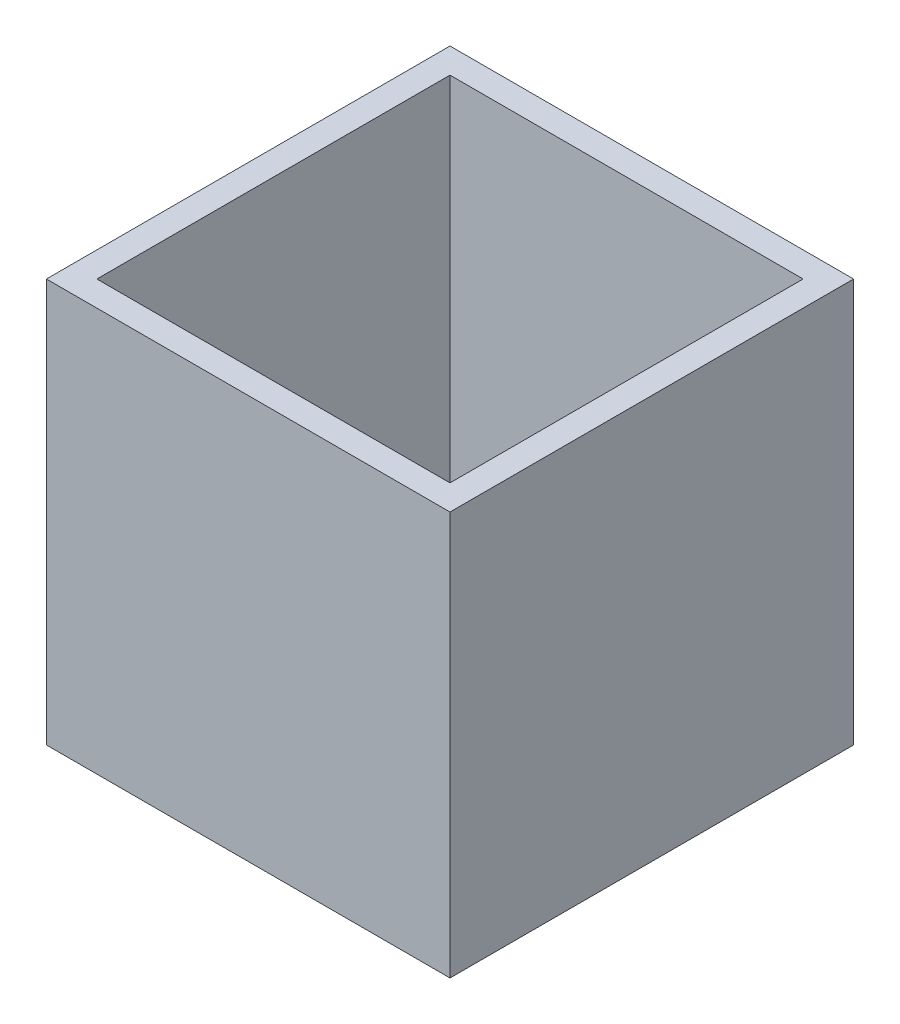
ISO-10303-21;
HEADER;
FILE_DESCRIPTION(('STEP AP214'),'2;1');
FILE_NAME('part.step','',(''),(''),'','','');
FILE_SCHEMA(('AUTOMOTIVE_DESIGN { 1 0 10303 214 1 1 1 1 }'));
ENDSEC;
DATA;
#1=APPLICATION_CONTEXT('core data for automotive mechanical design processes');
#2=APPLICATION_PROTOCOL_DEFINITION('international standard','automotive_design',2000,#1);
#3=PRODUCT_CONTEXT('',#1,'mechanical');
#4=PRODUCT('Part','Part','',(#3));
#5=PRODUCT_RELATED_PRODUCT_CATEGORY('part','',(#4));
#6=PRODUCT_DEFINITION_FORMATION('','',#4);
#7=PRODUCT_DEFINITION_CONTEXT('part definition',#1,'design');
#8=PRODUCT_DEFINITION('design','',#6,#7);
#9=PRODUCT_DEFINITION_SHAPE('','',#8);
#10=(LENGTH_UNIT() NAMED_UNIT(*) SI_UNIT(.MILLI.,.METRE.));
#11=(NAMED_UNIT(*) PLANE_ANGLE_UNIT() SI_UNIT($,.RADIAN.));
#12=(NAMED_UNIT(*) SI_UNIT($,.STERADIAN.) SOLID_ANGLE_UNIT());
#13=UNCERTAINTY_MEASURE_WITH_UNIT(LENGTH_MEASURE(1.E-05),#10,'distance_accuracy_value','');
#14=(GEOMETRIC_REPRESENTATION_CONTEXT(3) GLOBAL_UNCERTAINTY_ASSIGNED_CONTEXT((#13)) GLOBAL_UNIT_ASSIGNED_CONTEXT((#10,
#11,#12)) REPRESENTATION_CONTEXT('',''));
#15=CARTESIAN_POINT('',(0.,0.,0.));
#16=DIRECTION('',(0.,0.,1.));
#17=DIRECTION('',(1.,0.,0.));
#18=AXIS2_PLACEMENT_3D('',#15,#16,#17);
#19=CARTESIAN_POINT('',(0.,25.4,0.));
#20=DIRECTION('',(0.,-1.,0.));
#21=DIRECTION('',(0.,0.,-1.));
#22=AXIS2_PLACEMENT_3D('',#19,#20,#21);
#23=PLANE('',#22);
#24=DIRECTION('',(0.,0.,-1.));
#25=VECTOR('',#24,1.);
#26=CARTESIAN_POINT('',(12.7,25.4,12.7));
#27=LINE('',#26,#25);
#28=CARTESIAN_POINT('',(12.7,25.4,12.7));
#29=VERTEX_POINT('',#28);
#30=CARTESIAN_POINT('',(12.7,25.4,-12.7));
#31=VERTEX_POINT('',#30);
#32=EDGE_CURVE('E134',#29,#31,#27,.T.);
#33=ORIENTED_EDGE('',*,*,#32,.T.);
#34=DIRECTION('',(-1.,0.,0.));
#35=VECTOR('',#34,1.);
#36=CARTESIAN_POINT('',(-12.7,25.4,-12.7));
#37=LINE('',#36,#35);
#38=CARTESIAN_POINT('',(-12.7,25.4,-12.7));
#39=VERTEX_POINT('',#38);
#40=EDGE_CURVE('E137',#31,#39,#37,.T.);
#41=ORIENTED_EDGE('',*,*,#40,.T.);
#42=DIRECTION('',(0.,0.,1.));
#43=VECTOR('',#42,1.);
#44=CARTESIAN_POINT('',(-12.7,25.4,12.7));
#45=LINE('',#44,#43);
#46=CARTESIAN_POINT('',(-12.7,25.4,12.7));
#47=VERTEX_POINT('',#46);
#48=EDGE_CURVE('E140',#39,#47,#45,.T.);
#49=ORIENTED_EDGE('',*,*,#48,.T.);
#50=DIRECTION('',(1.,0.,0.));
#51=VECTOR('',#50,1.);
#52=CARTESIAN_POINT('',(-12.7,25.4,12.7));
#53=LINE('',#52,#51);
#54=EDGE_CURVE('E142',#47,#29,#53,.T.);
#55=ORIENTED_EDGE('',*,*,#54,.T.);
#56=EDGE_LOOP('',(#33,#41,#49,#55));
#57=FACE_BOUND('',#56,.T.);
#58=DIRECTION('',(0.,0.,1.));
#59=VECTOR('',#58,1.);
#60=CARTESIAN_POINT('',(-11.1125,25.4,11.1125));
#61=LINE('',#60,#59);
#62=CARTESIAN_POINT('',(-11.1125,25.4,-11.1125));
#63=VERTEX_POINT('',#62);
#64=CARTESIAN_POINT('',(-11.1125,25.4,11.1125));
#65=VERTEX_POINT('',#64);
#66=EDGE_CURVE('E98',#63,#65,#61,.T.);
#67=ORIENTED_EDGE('',*,*,#66,.F.);
#68=DIRECTION('',(-1.,0.,0.));
#69=VECTOR('',#68,1.);
#70=CARTESIAN_POINT('',(-11.1125,25.4,-11.1125));
#71=LINE('',#70,#69);
#72=CARTESIAN_POINT('',(11.1125,25.4,-11.1125));
#73=VERTEX_POINT('',#72);
#74=EDGE_CURVE('E120',#73,#63,#71,.T.);
#75=ORIENTED_EDGE('',*,*,#74,.F.);
#76=DIRECTION('',(0.,0.,-1.));
#77=VECTOR('',#76,1.);
#78=CARTESIAN_POINT('',(11.1125,25.4,11.1125));
#79=LINE('',#78,#77);
#80=CARTESIAN_POINT('',(11.1125,25.4,11.1125));
#81=VERTEX_POINT('',#80);
#82=EDGE_CURVE('E118',#81,#73,#79,.T.);
#83=ORIENTED_EDGE('',*,*,#82,.F.);
#84=DIRECTION('',(1.,0.,0.));
#85=VECTOR('',#84,1.);
#86=CARTESIAN_POINT('',(-11.1125,25.4,11.1125));
#87=LINE('',#86,#85);
#88=EDGE_CURVE('E106',#65,#81,#87,.T.);
#89=ORIENTED_EDGE('',*,*,#88,.F.);
#90=EDGE_LOOP('',(#67,#75,#83,#89));
#91=FACE_BOUND('',#90,.T.);
#92=ADVANCED_FACE('F33',(#57,#91),#23,.F.);
#93=CARTESIAN_POINT('',(0.,0.,0.));
#94=DIRECTION('',(0.,-1.,0.));
#95=DIRECTION('',(0.,0.,-1.));
#96=AXIS2_PLACEMENT_3D('',#93,#94,#95);
#97=PLANE('',#96);
#98=DIRECTION('',(0.,0.,-1.));
#99=VECTOR('',#98,1.);
#100=CARTESIAN_POINT('',(12.7,0.,12.7));
#101=LINE('',#100,#99);
#102=CARTESIAN_POINT('',(12.7,0.,12.7));
#103=VERTEX_POINT('',#102);
#104=CARTESIAN_POINT('',(12.7,0.,-12.7));
#105=VERTEX_POINT('',#104);
#106=EDGE_CURVE('E114',#103,#105,#101,.T.);
#107=ORIENTED_EDGE('',*,*,#106,.F.);
#108=DIRECTION('',(1.,0.,0.));
#109=VECTOR('',#108,1.);
#110=CARTESIAN_POINT('',(-12.7,0.,12.7));
#111=LINE('',#110,#109);
#112=CARTESIAN_POINT('',(-12.7,0.,12.7));
#113=VERTEX_POINT('',#112);
#114=EDGE_CURVE('E138',#113,#103,#111,.T.);
#115=ORIENTED_EDGE('',*,*,#114,.F.);
#116=DIRECTION('',(0.,0.,1.));
#117=VECTOR('',#116,1.);
#118=CARTESIAN_POINT('',(-12.7,0.,12.7));
#119=LINE('',#118,#117);
#120=CARTESIAN_POINT('',(-12.7,0.,-12.7));
#121=VERTEX_POINT('',#120);
#122=EDGE_CURVE('E149',#121,#113,#119,.T.);
#123=ORIENTED_EDGE('',*,*,#122,.F.);
#124=DIRECTION('',(-1.,0.,0.));
#125=VECTOR('',#124,1.);
#126=CARTESIAN_POINT('',(-12.7,0.,-12.7));
#127=LINE('',#126,#125);
#128=EDGE_CURVE('E147',#105,#121,#127,.T.);
#129=ORIENTED_EDGE('',*,*,#128,.F.);
#130=EDGE_LOOP('',(#107,#115,#123,#129));
#131=FACE_BOUND('',#130,.T.);
#132=DIRECTION('',(-1.,0.,0.));
#133=VECTOR('',#132,1.);
#134=CARTESIAN_POINT('',(-11.1125,0.,-11.1125));
#135=LINE('',#134,#133);
#136=CARTESIAN_POINT('',(11.1125,0.,-11.1125));
#137=VERTEX_POINT('',#136);
#138=CARTESIAN_POINT('',(-11.1125,0.,-11.1125));
#139=VERTEX_POINT('',#138);
#140=EDGE_CURVE('E107',#137,#139,#135,.T.);
#141=ORIENTED_EDGE('',*,*,#140,.T.);
#142=DIRECTION('',(0.,0.,1.));
#143=VECTOR('',#142,1.);
#144=CARTESIAN_POINT('',(-11.1125,0.,11.1125));
#145=LINE('',#144,#143);
#146=CARTESIAN_POINT('',(-11.1125,0.,11.1125));
#147=VERTEX_POINT('',#146);
#148=EDGE_CURVE('E56',#139,#147,#145,.T.);
#149=ORIENTED_EDGE('',*,*,#148,.T.);
#150=DIRECTION('',(1.,0.,0.));
#151=VECTOR('',#150,1.);
#152=CARTESIAN_POINT('',(-11.1125,0.,11.1125));
#153=LINE('',#152,#151);
#154=CARTESIAN_POINT('',(11.1125,0.,11.1125));
#155=VERTEX_POINT('',#154);
#156=EDGE_CURVE('E113',#147,#155,#153,.T.);
#157=ORIENTED_EDGE('',*,*,#156,.T.);
#158=DIRECTION('',(0.,0.,-1.));
#159=VECTOR('',#158,1.);
#160=CARTESIAN_POINT('',(11.1125,0.,11.1125));
#161=LINE('',#160,#159);
#162=EDGE_CURVE('E126',#155,#137,#161,.T.);
#163=ORIENTED_EDGE('',*,*,#162,.T.);
#164=EDGE_LOOP('',(#141,#149,#157,#163));
#165=FACE_BOUND('',#164,.T.);
#166=ADVANCED_FACE('F167',(#131,#165),#97,.T.);
#167=CARTESIAN_POINT('',(12.7,25.4,12.7));
#168=DIRECTION('',(-1.,0.,0.));
#169=DIRECTION('',(0.,0.,1.));
#170=AXIS2_PLACEMENT_3D('',#167,#168,#169);
#171=PLANE('',#170);
#172=ORIENTED_EDGE('',*,*,#106,.T.);
#173=DIRECTION('',(0.,-1.,0.));
#174=VECTOR('',#173,1.);
#175=CARTESIAN_POINT('',(12.7,25.4,-12.7));
#176=LINE('',#175,#174);
#177=EDGE_CURVE('E11',#31,#105,#176,.T.);
#178=ORIENTED_EDGE('',*,*,#177,.F.);
#179=ORIENTED_EDGE('',*,*,#32,.F.);
#180=DIRECTION('',(0.,-1.,0.));
#181=VECTOR('',#180,1.);
#182=CARTESIAN_POINT('',(12.7,25.4,12.7));
#183=LINE('',#182,#181);
#184=EDGE_CURVE('E144',#29,#103,#183,.T.);
#185=ORIENTED_EDGE('',*,*,#184,.T.);
#186=EDGE_LOOP('',(#172,#178,#179,#185));
#187=FACE_BOUND('',#186,.T.);
#188=ADVANCED_FACE('F35',(#187),#171,.F.);
#189=CARTESIAN_POINT('',(-12.7,25.4,-12.7));
#190=DIRECTION('',(0.,0.,1.));
#191=DIRECTION('',(1.,0.,0.));
#192=AXIS2_PLACEMENT_3D('',#189,#190,#191);
#193=PLANE('',#192);
#194=ORIENTED_EDGE('',*,*,#128,.T.);
#195=DIRECTION('',(0.,-1.,0.));
#196=VECTOR('',#195,1.);
#197=CARTESIAN_POINT('',(-12.7,25.4,-12.7));
#198=LINE('',#197,#196);
#199=EDGE_CURVE('E41',#39,#121,#198,.T.);
#200=ORIENTED_EDGE('',*,*,#199,.F.);
#201=ORIENTED_EDGE('',*,*,#40,.F.);
#202=ORIENTED_EDGE('',*,*,#177,.T.);
#203=EDGE_LOOP('',(#194,#200,#201,#202));
#204=FACE_BOUND('',#203,.T.);
#205=ADVANCED_FACE('F177',(#204),#193,.F.);
#206=CARTESIAN_POINT('',(-12.7,25.4,12.7));
#207=DIRECTION('',(1.,0.,0.));
#208=DIRECTION('',(0.,0.,-1.));
#209=AXIS2_PLACEMENT_3D('',#206,#207,#208);
#210=PLANE('',#209);
#211=ORIENTED_EDGE('',*,*,#122,.T.);
#212=DIRECTION('',(0.,-1.,0.));
#213=VECTOR('',#212,1.);
#214=CARTESIAN_POINT('',(-12.7,25.4,12.7));
#215=LINE('',#214,#213);
#216=EDGE_CURVE('E154',#47,#113,#215,.T.);
#217=ORIENTED_EDGE('',*,*,#216,.F.);
#218=ORIENTED_EDGE('',*,*,#48,.F.);
#219=ORIENTED_EDGE('',*,*,#199,.T.);
#220=EDGE_LOOP('',(#211,#217,#218,#219));
#221=FACE_BOUND('',#220,.T.);
#222=ADVANCED_FACE('F161',(#221),#210,.F.);
#223=CARTESIAN_POINT('',(-12.7,25.4,12.7));
#224=DIRECTION('',(0.,0.,-1.));
#225=DIRECTION('',(-1.,0.,0.));
#226=AXIS2_PLACEMENT_3D('',#223,#224,#225);
#227=PLANE('',#226);
#228=ORIENTED_EDGE('',*,*,#114,.T.);
#229=ORIENTED_EDGE('',*,*,#184,.F.);
#230=ORIENTED_EDGE('',*,*,#54,.F.);
#231=ORIENTED_EDGE('',*,*,#216,.T.);
#232=EDGE_LOOP('',(#228,#229,#230,#231));
#233=FACE_BOUND('',#232,.T.);
#234=ADVANCED_FACE('F171',(#233),#227,.F.);
#235=CARTESIAN_POINT('',(-11.1125,25.4,11.1125));
#236=DIRECTION('',(1.,0.,0.));
#237=DIRECTION('',(0.,0.,-1.));
#238=AXIS2_PLACEMENT_3D('',#235,#236,#237);
#239=PLANE('',#238);
#240=ORIENTED_EDGE('',*,*,#148,.F.);
#241=DIRECTION('',(0.,-1.,0.));
#242=VECTOR('',#241,1.);
#243=CARTESIAN_POINT('',(-11.1125,25.4,-11.1125));
#244=LINE('',#243,#242);
#245=EDGE_CURVE('E102',#63,#139,#244,.T.);
#246=ORIENTED_EDGE('',*,*,#245,.F.);
#247=ORIENTED_EDGE('',*,*,#66,.T.);
#248=DIRECTION('',(0.,-1.,0.));
#249=VECTOR('',#248,1.);
#250=CARTESIAN_POINT('',(-11.1125,25.4,11.1125));
#251=LINE('',#250,#249);
#252=EDGE_CURVE('E101',#65,#147,#251,.T.);
#253=ORIENTED_EDGE('',*,*,#252,.T.);
#254=EDGE_LOOP('',(#240,#246,#247,#253));
#255=FACE_BOUND('',#254,.T.);
#256=ADVANCED_FACE('F100',(#255),#239,.T.);
#257=CARTESIAN_POINT('',(-11.1125,25.4,11.1125));
#258=DIRECTION('',(0.,0.,-1.));
#259=DIRECTION('',(-1.,0.,0.));
#260=AXIS2_PLACEMENT_3D('',#257,#258,#259);
#261=PLANE('',#260);
#262=ORIENTED_EDGE('',*,*,#156,.F.);
#263=ORIENTED_EDGE('',*,*,#252,.F.);
#264=ORIENTED_EDGE('',*,*,#88,.T.);
#265=DIRECTION('',(0.,-1.,0.));
#266=VECTOR('',#265,1.);
#267=CARTESIAN_POINT('',(11.1125,25.4,11.1125));
#268=LINE('',#267,#266);
#269=EDGE_CURVE('E115',#81,#155,#268,.T.);
#270=ORIENTED_EDGE('',*,*,#269,.T.);
#271=EDGE_LOOP('',(#262,#263,#264,#270));
#272=FACE_BOUND('',#271,.T.);
#273=ADVANCED_FACE('F110',(#272),#261,.T.);
#274=CARTESIAN_POINT('',(11.1125,25.4,11.1125));
#275=DIRECTION('',(-1.,0.,0.));
#276=DIRECTION('',(0.,0.,1.));
#277=AXIS2_PLACEMENT_3D('',#274,#275,#276);
#278=PLANE('',#277);
#279=ORIENTED_EDGE('',*,*,#162,.F.);
#280=ORIENTED_EDGE('',*,*,#269,.F.);
#281=ORIENTED_EDGE('',*,*,#82,.T.);
#282=DIRECTION('',(0.,-1.,0.));
#283=VECTOR('',#282,1.);
#284=CARTESIAN_POINT('',(11.1125,25.4,-11.1125));
#285=LINE('',#284,#283);
#286=EDGE_CURVE('E48',#73,#137,#285,.T.);
#287=ORIENTED_EDGE('',*,*,#286,.T.);
#288=EDGE_LOOP('',(#279,#280,#281,#287));
#289=FACE_BOUND('',#288,.T.);
#290=ADVANCED_FACE('F200',(#289),#278,.T.);
#291=CARTESIAN_POINT('',(-11.1125,25.4,-11.1125));
#292=DIRECTION('',(0.,0.,1.));
#293=DIRECTION('',(1.,0.,0.));
#294=AXIS2_PLACEMENT_3D('',#291,#292,#293);
#295=PLANE('',#294);
#296=ORIENTED_EDGE('',*,*,#140,.F.);
#297=ORIENTED_EDGE('',*,*,#286,.F.);
#298=ORIENTED_EDGE('',*,*,#74,.T.);
#299=ORIENTED_EDGE('',*,*,#245,.T.);
#300=EDGE_LOOP('',(#296,#297,#298,#299));
#301=FACE_BOUND('',#300,.T.);
#302=ADVANCED_FACE('F204',(#301),#295,.T.);
#303=CLOSED_SHELL('',(#92,#166,#188,#205,#222,#234,#256,#273,#290,#302));
#304=MANIFOLD_SOLID_BREP('B2',#303);
#305=ADVANCED_BREP_SHAPE_REPRESENTATION('',(#18,#304),#14);
#306=SHAPE_DEFINITION_REPRESENTATION(#9,#305);
ENDSEC;
END-ISO-10303-21;
